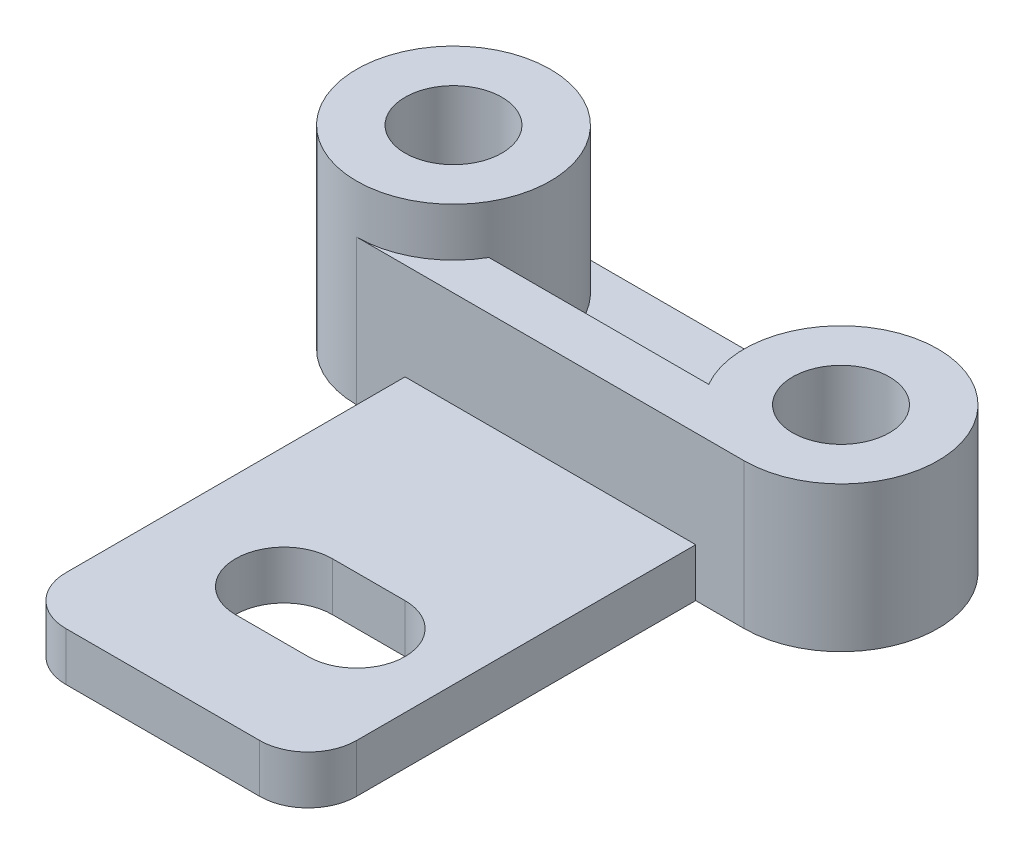
ISO-10303-21;
HEADER;
FILE_DESCRIPTION(('STEP AP214'),'2;1');
FILE_NAME('part.step','',(''),(''),'','','');
FILE_SCHEMA(('AUTOMOTIVE_DESIGN { 1 0 10303 214 1 1 1 1 }'));
ENDSEC;
DATA;
#1=APPLICATION_CONTEXT('core data for automotive mechanical design processes');
#2=APPLICATION_PROTOCOL_DEFINITION('international standard','automotive_design',2000,#1);
#3=PRODUCT_CONTEXT('',#1,'mechanical');
#4=PRODUCT('Part','Part','',(#3));
#5=PRODUCT_RELATED_PRODUCT_CATEGORY('part','',(#4));
#6=PRODUCT_DEFINITION_FORMATION('','',#4);
#7=PRODUCT_DEFINITION_CONTEXT('part definition',#1,'design');
#8=PRODUCT_DEFINITION('design','',#6,#7);
#9=PRODUCT_DEFINITION_SHAPE('','',#8);
#10=(LENGTH_UNIT() NAMED_UNIT(*) SI_UNIT(.MILLI.,.METRE.));
#11=(NAMED_UNIT(*) PLANE_ANGLE_UNIT() SI_UNIT($,.RADIAN.));
#12=(NAMED_UNIT(*) SI_UNIT($,.STERADIAN.) SOLID_ANGLE_UNIT());
#13=UNCERTAINTY_MEASURE_WITH_UNIT(LENGTH_MEASURE(1.E-05),#10,'distance_accuracy_value','');
#14=(GEOMETRIC_REPRESENTATION_CONTEXT(3) GLOBAL_UNCERTAINTY_ASSIGNED_CONTEXT((#13)) GLOBAL_UNIT_ASSIGNED_CONTEXT((#10,
#11,#12)) REPRESENTATION_CONTEXT('',''));
#15=CARTESIAN_POINT('',(0.,0.,0.));
#16=DIRECTION('',(0.,0.,1.));
#17=DIRECTION('',(1.,0.,0.));
#18=AXIS2_PLACEMENT_3D('',#15,#16,#17);
#19=CARTESIAN_POINT('',(0.,0.,20.));
#20=DIRECTION('',(0.,0.,1.));
#21=DIRECTION('',(1.,0.,0.));
#22=AXIS2_PLACEMENT_3D('',#19,#20,#21);
#23=PLANE('',#22);
#24=DIRECTION('',(1.,0.,0.));
#25=VECTOR('',#24,1.);
#26=CARTESIAN_POINT('',(0.,0.,20.));
#27=LINE('',#26,#25);
#28=CARTESIAN_POINT('',(0.,0.,20.));
#29=VERTEX_POINT('',#28);
#30=CARTESIAN_POINT('',(10.,0.,20.));
#31=VERTEX_POINT('',#30);
#32=EDGE_CURVE('E312',#29,#31,#27,.T.);
#33=ORIENTED_EDGE('',*,*,#32,.T.);
#34=DIRECTION('',(0.,-1.,0.));
#35=VECTOR('',#34,1.);
#36=CARTESIAN_POINT('',(10.,10.,20.));
#37=LINE('',#36,#35);
#38=CARTESIAN_POINT('',(10.,10.,20.));
#39=VERTEX_POINT('',#38);
#40=EDGE_CURVE('E237',#39,#31,#37,.T.);
#41=ORIENTED_EDGE('',*,*,#40,.F.);
#42=DIRECTION('',(-1.,0.,0.));
#43=VECTOR('',#42,1.);
#44=CARTESIAN_POINT('',(10.,10.,20.));
#45=LINE('',#44,#43);
#46=CARTESIAN_POINT('',(70.,10.,20.));
#47=VERTEX_POINT('',#46);
#48=EDGE_CURVE('E234',#47,#39,#45,.T.);
#49=ORIENTED_EDGE('',*,*,#48,.F.);
#50=DIRECTION('',(0.,-1.,0.));
#51=VECTOR('',#50,1.);
#52=CARTESIAN_POINT('',(70.,10.,20.));
#53=LINE('',#52,#51);
#54=CARTESIAN_POINT('',(70.,0.,20.));
#55=VERTEX_POINT('',#54);
#56=EDGE_CURVE('E254',#47,#55,#53,.T.);
#57=ORIENTED_EDGE('',*,*,#56,.T.);
#58=CARTESIAN_POINT('',(80.,0.,20.));
#59=VERTEX_POINT('',#58);
#60=EDGE_CURVE('E317',#55,#59,#27,.T.);
#61=ORIENTED_EDGE('',*,*,#60,.T.);
#62=DIRECTION('',(0.,1.,0.));
#63=VECTOR('',#62,1.);
#64=CARTESIAN_POINT('',(80.,0.,20.));
#65=LINE('',#64,#63);
#66=CARTESIAN_POINT('',(80.,30.,20.));
#67=VERTEX_POINT('',#66);
#68=EDGE_CURVE('E324',#59,#67,#65,.T.);
#69=ORIENTED_EDGE('',*,*,#68,.T.);
#70=DIRECTION('',(1.,0.,0.));
#71=VECTOR('',#70,1.);
#72=CARTESIAN_POINT('',(0.,30.,20.));
#73=LINE('',#72,#71);
#74=CARTESIAN_POINT('',(0.,30.,20.));
#75=VERTEX_POINT('',#74);
#76=EDGE_CURVE('E320',#75,#67,#73,.T.);
#77=ORIENTED_EDGE('',*,*,#76,.F.);
#78=DIRECTION('',(0.,1.,0.));
#79=VECTOR('',#78,1.);
#80=CARTESIAN_POINT('',(0.,0.,20.));
#81=LINE('',#80,#79);
#82=EDGE_CURVE('E316',#29,#75,#81,.T.);
#83=ORIENTED_EDGE('',*,*,#82,.F.);
#84=EDGE_LOOP('',(#33,#41,#49,#57,#61,#69,#77,#83));
#85=FACE_BOUND('',#84,.T.);
#86=ADVANCED_FACE('F45',(#85),#23,.T.);
#87=CARTESIAN_POINT('',(0.,0.,10.));
#88=DIRECTION('',(0.,0.,-1.));
#89=DIRECTION('',(-1.,0.,0.));
#90=AXIS2_PLACEMENT_3D('',#87,#88,#89);
#91=PLANE('',#90);
#92=DIRECTION('',(0.,-1.,0.));
#93=VECTOR('',#92,1.);
#94=CARTESIAN_POINT('',(62.6794919243112,30.,10.));
#95=LINE('',#94,#93);
#96=CARTESIAN_POINT('',(62.6794919243112,30.,10.));
#97=VERTEX_POINT('',#96);
#98=CARTESIAN_POINT('',(62.6794919243112,9.99999999999999,10.));
#99=VERTEX_POINT('',#98);
#100=EDGE_CURVE('E305',#97,#99,#95,.T.);
#101=ORIENTED_EDGE('',*,*,#100,.T.);
#102=DIRECTION('',(-1.,0.,0.));
#103=VECTOR('',#102,1.);
#104=CARTESIAN_POINT('',(0.,10.,10.));
#105=LINE('',#104,#103);
#106=CARTESIAN_POINT('',(17.3205080756888,9.99999999999999,10.));
#107=VERTEX_POINT('',#106);
#108=EDGE_CURVE('E291',#99,#107,#105,.T.);
#109=ORIENTED_EDGE('',*,*,#108,.T.);
#110=DIRECTION('',(0.,-1.,0.));
#111=VECTOR('',#110,1.);
#112=CARTESIAN_POINT('',(17.3205080756888,40.,10.));
#113=LINE('',#112,#111);
#114=CARTESIAN_POINT('',(17.3205080756888,30.,10.));
#115=VERTEX_POINT('',#114);
#116=EDGE_CURVE('E333',#115,#107,#113,.T.);
#117=ORIENTED_EDGE('',*,*,#116,.F.);
#118=DIRECTION('',(-1.,0.,0.));
#119=VECTOR('',#118,1.);
#120=CARTESIAN_POINT('',(0.,30.,10.));
#121=LINE('',#120,#119);
#122=EDGE_CURVE('E311',#97,#115,#121,.T.);
#123=ORIENTED_EDGE('',*,*,#122,.F.);
#124=EDGE_LOOP('',(#101,#109,#117,#123));
#125=FACE_BOUND('',#124,.T.);
#126=ADVANCED_FACE('F383',(#125),#91,.T.);
#127=CARTESIAN_POINT('',(0.,0.,0.));
#128=DIRECTION('',(0.,1.,0.));
#129=DIRECTION('',(0.,0.,1.));
#130=AXIS2_PLACEMENT_3D('',#127,#128,#129);
#131=CYLINDRICAL_SURFACE('',#130,10.);
#132=CARTESIAN_POINT('',(0.,40.,0.));
#133=DIRECTION('',(0.,1.,0.));
#134=DIRECTION('',(0.,0.,1.));
#135=AXIS2_PLACEMENT_3D('',#132,#133,#134);
#136=CIRCLE('',#135,10.);
#137=CARTESIAN_POINT('',(0.,40.,10.));
#138=VERTEX_POINT('',#137);
#139=EDGE_CURVE('E336',#138,#138,#136,.T.);
#140=ORIENTED_EDGE('',*,*,#139,.T.);
#141=EDGE_LOOP('',(#140));
#142=FACE_BOUND('',#141,.T.);
#143=CARTESIAN_POINT('',(0.,10.,0.));
#144=DIRECTION('',(0.,-1.,0.));
#145=DIRECTION('',(0.,0.,-1.));
#146=AXIS2_PLACEMENT_3D('',#143,#144,#145);
#147=CIRCLE('',#146,10.);
#148=CARTESIAN_POINT('',(0.,10.,-10.));
#149=VERTEX_POINT('',#148);
#150=EDGE_CURVE('E11',#149,#149,#147,.F.);
#151=ORIENTED_EDGE('',*,*,#150,.F.);
#152=EDGE_LOOP('',(#151));
#153=FACE_BOUND('',#152,.T.);
#154=ADVANCED_FACE('F390',(#142,#153),#131,.F.);
#155=CARTESIAN_POINT('',(80.,30.,0.));
#156=DIRECTION('',(0.,-1.,0.));
#157=DIRECTION('',(0.,0.,-1.));
#158=AXIS2_PLACEMENT_3D('',#155,#156,#157);
#159=CYLINDRICAL_SURFACE('',#158,20.);
#160=CARTESIAN_POINT('',(80.,30.,0.));
#161=DIRECTION('',(0.,1.,0.));
#162=DIRECTION('',(0.,0.,1.));
#163=AXIS2_PLACEMENT_3D('',#160,#161,#162);
#164=CIRCLE('',#163,20.);
#165=EDGE_CURVE('E301',#67,#97,#164,.T.);
#166=ORIENTED_EDGE('',*,*,#165,.F.);
#167=ORIENTED_EDGE('',*,*,#68,.F.);
#168=CARTESIAN_POINT('',(80.,0.,0.));
#169=DIRECTION('',(0.,1.,0.));
#170=DIRECTION('',(0.,0.,1.));
#171=AXIS2_PLACEMENT_3D('',#168,#169,#170);
#172=CIRCLE('',#171,20.);
#173=CARTESIAN_POINT('',(80.,0.,-20.));
#174=VERTEX_POINT('',#173);
#175=EDGE_CURVE('E300',#59,#174,#172,.T.);
#176=ORIENTED_EDGE('',*,*,#175,.T.);
#177=DIRECTION('',(0.,-1.,0.));
#178=VECTOR('',#177,1.);
#179=CARTESIAN_POINT('',(80.,10.,-20.));
#180=LINE('',#179,#178);
#181=CARTESIAN_POINT('',(80.,9.99999999999999,-20.));
#182=VERTEX_POINT('',#181);
#183=EDGE_CURVE('E281',#182,#174,#180,.T.);
#184=ORIENTED_EDGE('',*,*,#183,.F.);
#185=CARTESIAN_POINT('',(80.,9.99999999999999,0.));
#186=DIRECTION('',(0.,-1.,0.));
#187=DIRECTION('',(0.,0.,-1.));
#188=AXIS2_PLACEMENT_3D('',#185,#186,#187);
#189=CIRCLE('',#188,20.);
#190=EDGE_CURVE('E285',#99,#182,#189,.T.);
#191=ORIENTED_EDGE('',*,*,#190,.F.);
#192=ORIENTED_EDGE('',*,*,#100,.F.);
#193=EDGE_LOOP('',(#166,#167,#176,#184,#191,#192));
#194=FACE_BOUND('',#193,.T.);
#195=ADVANCED_FACE('F399',(#194),#159,.T.);
#196=CARTESIAN_POINT('',(80.,0.,0.));
#197=DIRECTION('',(0.,1.,0.));
#198=DIRECTION('',(0.,0.,1.));
#199=AXIS2_PLACEMENT_3D('',#196,#197,#198);
#200=CYLINDRICAL_SURFACE('',#199,9.99999999999999);
#201=CARTESIAN_POINT('',(80.,30.,0.));
#202=DIRECTION('',(0.,1.,0.));
#203=DIRECTION('',(0.,0.,1.));
#204=AXIS2_PLACEMENT_3D('',#201,#202,#203);
#205=CIRCLE('',#204,9.99999999999999);
#206=CARTESIAN_POINT('',(80.,30.,9.99999999999999));
#207=VERTEX_POINT('',#206);
#208=EDGE_CURVE('E295',#207,#207,#205,.T.);
#209=ORIENTED_EDGE('',*,*,#208,.T.);
#210=EDGE_LOOP('',(#209));
#211=FACE_BOUND('',#210,.T.);
#212=CARTESIAN_POINT('',(80.,10.,0.));
#213=DIRECTION('',(0.,-1.,0.));
#214=DIRECTION('',(0.,0.,-1.));
#215=AXIS2_PLACEMENT_3D('',#212,#213,#214);
#216=CIRCLE('',#215,9.99999999999999);
#217=CARTESIAN_POINT('',(80.,10.,-9.99999999999999));
#218=VERTEX_POINT('',#217);
#219=EDGE_CURVE('E49',#218,#218,#216,.F.);
#220=ORIENTED_EDGE('',*,*,#219,.F.);
#221=EDGE_LOOP('',(#220));
#222=FACE_BOUND('',#221,.T.);
#223=ADVANCED_FACE('F422',(#211,#222),#200,.F.);
#224=CARTESIAN_POINT('',(0.,40.,0.));
#225=DIRECTION('',(0.,-1.,0.));
#226=DIRECTION('',(0.,0.,-1.));
#227=AXIS2_PLACEMENT_3D('',#224,#225,#226);
#228=CYLINDRICAL_SURFACE('',#227,20.);
#229=ORIENTED_EDGE('',*,*,#82,.T.);
#230=CARTESIAN_POINT('',(0.,30.,0.));
#231=DIRECTION('',(0.,1.,0.));
#232=DIRECTION('',(0.,0.,1.));
#233=AXIS2_PLACEMENT_3D('',#230,#231,#232);
#234=CIRCLE('',#233,20.);
#235=EDGE_CURVE('E327',#75,#115,#234,.T.);
#236=ORIENTED_EDGE('',*,*,#235,.T.);
#237=ORIENTED_EDGE('',*,*,#116,.T.);
#238=CARTESIAN_POINT('',(0.,9.99999999999999,0.));
#239=DIRECTION('',(0.,-1.,0.));
#240=DIRECTION('',(0.,0.,-1.));
#241=AXIS2_PLACEMENT_3D('',#238,#239,#240);
#242=CIRCLE('',#241,20.);
#243=CARTESIAN_POINT('',(0.,9.99999999999999,-20.));
#244=VERTEX_POINT('',#243);
#245=EDGE_CURVE('E70',#244,#107,#242,.T.);
#246=ORIENTED_EDGE('',*,*,#245,.F.);
#247=DIRECTION('',(0.,-1.,0.));
#248=VECTOR('',#247,1.);
#249=CARTESIAN_POINT('',(0.,10.,-20.));
#250=LINE('',#249,#248);
#251=CARTESIAN_POINT('',(0.,0.,-20.));
#252=VERTEX_POINT('',#251);
#253=EDGE_CURVE('E277',#244,#252,#250,.T.);
#254=ORIENTED_EDGE('',*,*,#253,.T.);
#255=CARTESIAN_POINT('',(0.,0.,0.));
#256=DIRECTION('',(0.,1.,0.));
#257=DIRECTION('',(0.,0.,1.));
#258=AXIS2_PLACEMENT_3D('',#255,#256,#257);
#259=CIRCLE('',#258,20.);
#260=EDGE_CURVE('E340',#252,#29,#259,.T.);
#261=ORIENTED_EDGE('',*,*,#260,.T.);
#262=EDGE_LOOP('',(#229,#236,#237,#246,#254,#261));
#263=FACE_BOUND('',#262,.T.);
#264=CARTESIAN_POINT('',(0.,40.,0.));
#265=DIRECTION('',(0.,1.,0.));
#266=DIRECTION('',(0.,0.,1.));
#267=AXIS2_PLACEMENT_3D('',#264,#265,#266);
#268=CIRCLE('',#267,20.);
#269=CARTESIAN_POINT('',(0.,40.,20.));
#270=VERTEX_POINT('',#269);
#271=EDGE_CURVE('E341',#270,#270,#268,.T.);
#272=ORIENTED_EDGE('',*,*,#271,.F.);
#273=EDGE_LOOP('',(#272));
#274=FACE_BOUND('',#273,.T.);
#275=ADVANCED_FACE('F47',(#263,#274),#228,.T.);
#276=CARTESIAN_POINT('',(0.,40.,0.));
#277=DIRECTION('',(0.,1.,0.));
#278=DIRECTION('',(0.,0.,1.));
#279=AXIS2_PLACEMENT_3D('',#276,#277,#278);
#280=PLANE('',#279);
#281=ORIENTED_EDGE('',*,*,#139,.F.);
#282=EDGE_LOOP('',(#281));
#283=FACE_BOUND('',#282,.T.);
#284=ORIENTED_EDGE('',*,*,#271,.T.);
#285=EDGE_LOOP('',(#284));
#286=FACE_BOUND('',#285,.T.);
#287=ADVANCED_FACE('F401',(#283,#286),#280,.T.);
#288=CARTESIAN_POINT('',(0.,0.,0.));
#289=DIRECTION('',(0.,1.,0.));
#290=DIRECTION('',(0.,0.,1.));
#291=AXIS2_PLACEMENT_3D('',#288,#289,#290);
#292=PLANE('',#291);
#293=ORIENTED_EDGE('',*,*,#260,.F.);
#294=DIRECTION('',(1.,0.,0.));
#295=VECTOR('',#294,1.);
#296=CARTESIAN_POINT('',(0.,0.,-20.));
#297=LINE('',#296,#295);
#298=EDGE_CURVE('E272',#252,#174,#297,.T.);
#299=ORIENTED_EDGE('',*,*,#298,.T.);
#300=ORIENTED_EDGE('',*,*,#175,.F.);
#301=ORIENTED_EDGE('',*,*,#60,.F.);
#302=DIRECTION('',(0.,0.,-1.));
#303=VECTOR('',#302,1.);
#304=CARTESIAN_POINT('',(70.,0.,20.));
#305=LINE('',#304,#303);
#306=CARTESIAN_POINT('',(70.,0.,90.));
#307=VERTEX_POINT('',#306);
#308=EDGE_CURVE('E62',#307,#55,#305,.T.);
#309=ORIENTED_EDGE('',*,*,#308,.F.);
#310=CARTESIAN_POINT('',(60.,0.,90.));
#311=DIRECTION('',(0.,1.,0.));
#312=DIRECTION('',(0.,0.,1.));
#313=AXIS2_PLACEMENT_3D('',#310,#311,#312);
#314=CIRCLE('',#313,9.99999999999999);
#315=CARTESIAN_POINT('',(60.,0.,100.));
#316=VERTEX_POINT('',#315);
#317=EDGE_CURVE('E247',#316,#307,#314,.T.);
#318=ORIENTED_EDGE('',*,*,#317,.F.);
#319=DIRECTION('',(1.,0.,0.));
#320=VECTOR('',#319,1.);
#321=CARTESIAN_POINT('',(20.,0.,100.));
#322=LINE('',#321,#320);
#323=CARTESIAN_POINT('',(20.,0.,100.));
#324=VERTEX_POINT('',#323);
#325=EDGE_CURVE('E244',#324,#316,#322,.T.);
#326=ORIENTED_EDGE('',*,*,#325,.F.);
#327=CARTESIAN_POINT('',(20.,0.,90.));
#328=DIRECTION('',(0.,1.,0.));
#329=DIRECTION('',(0.,0.,1.));
#330=AXIS2_PLACEMENT_3D('',#327,#328,#329);
#331=CIRCLE('',#330,10.);
#332=CARTESIAN_POINT('',(10.,0.,90.));
#333=VERTEX_POINT('',#332);
#334=EDGE_CURVE('E241',#333,#324,#331,.T.);
#335=ORIENTED_EDGE('',*,*,#334,.F.);
#336=DIRECTION('',(0.,0.,1.));
#337=VECTOR('',#336,1.);
#338=CARTESIAN_POINT('',(10.,0.,20.));
#339=LINE('',#338,#337);
#340=EDGE_CURVE('E184',#31,#333,#339,.T.);
#341=ORIENTED_EDGE('',*,*,#340,.F.);
#342=ORIENTED_EDGE('',*,*,#32,.F.);
#343=EDGE_LOOP('',(#293,#299,#300,#301,#309,#318,#326,#335,#341,#342));
#344=FACE_BOUND('',#343,.T.);
#345=CARTESIAN_POINT('',(35.,0.,70.));
#346=DIRECTION('',(0.,1.,0.));
#347=DIRECTION('',(0.,0.,1.));
#348=AXIS2_PLACEMENT_3D('',#345,#346,#347);
#349=CIRCLE('',#348,10.);
#350=CARTESIAN_POINT('',(35.,0.,60.));
#351=VERTEX_POINT('',#350);
#352=CARTESIAN_POINT('',(35.,0.,80.));
#353=VERTEX_POINT('',#352);
#354=EDGE_CURVE('E199',#351,#353,#349,.T.);
#355=ORIENTED_EDGE('',*,*,#354,.T.);
#356=DIRECTION('',(1.,0.,0.));
#357=VECTOR('',#356,1.);
#358=CARTESIAN_POINT('',(35.,0.,80.));
#359=LINE('',#358,#357);
#360=CARTESIAN_POINT('',(50.,0.,80.));
#361=VERTEX_POINT('',#360);
#362=EDGE_CURVE('E182',#353,#361,#359,.T.);
#363=ORIENTED_EDGE('',*,*,#362,.T.);
#364=CARTESIAN_POINT('',(50.,0.,70.));
#365=DIRECTION('',(0.,1.,0.));
#366=DIRECTION('',(0.,0.,1.));
#367=AXIS2_PLACEMENT_3D('',#364,#365,#366);
#368=CIRCLE('',#367,10.);
#369=CARTESIAN_POINT('',(50.,0.,60.));
#370=VERTEX_POINT('',#369);
#371=EDGE_CURVE('E204',#361,#370,#368,.T.);
#372=ORIENTED_EDGE('',*,*,#371,.T.);
#373=DIRECTION('',(-1.,0.,0.));
#374=VECTOR('',#373,1.);
#375=CARTESIAN_POINT('',(35.,0.,60.));
#376=LINE('',#375,#374);
#377=EDGE_CURVE('E176',#370,#351,#376,.T.);
#378=ORIENTED_EDGE('',*,*,#377,.T.);
#379=EDGE_LOOP('',(#355,#363,#372,#378));
#380=FACE_BOUND('',#379,.T.);
#381=ADVANCED_FACE('F356',(#344,#380),#292,.F.);
#382=CARTESIAN_POINT('',(0.,30.,0.));
#383=DIRECTION('',(0.,1.,0.));
#384=DIRECTION('',(0.,0.,1.));
#385=AXIS2_PLACEMENT_3D('',#382,#383,#384);
#386=PLANE('',#385);
#387=ORIENTED_EDGE('',*,*,#165,.T.);
#388=ORIENTED_EDGE('',*,*,#122,.T.);
#389=ORIENTED_EDGE('',*,*,#235,.F.);
#390=ORIENTED_EDGE('',*,*,#76,.T.);
#391=EDGE_LOOP('',(#387,#388,#389,#390));
#392=FACE_BOUND('',#391,.T.);
#393=ORIENTED_EDGE('',*,*,#208,.F.);
#394=EDGE_LOOP('',(#393));
#395=FACE_BOUND('',#394,.T.);
#396=ADVANCED_FACE('F394',(#392,#395),#386,.T.);
#397=CARTESIAN_POINT('',(0.,10.,0.));
#398=DIRECTION('',(0.,-1.,0.));
#399=DIRECTION('',(0.,0.,-1.));
#400=AXIS2_PLACEMENT_3D('',#397,#398,#399);
#401=PLANE('',#400);
#402=ORIENTED_EDGE('',*,*,#219,.T.);
#403=EDGE_LOOP('',(#402));
#404=FACE_BOUND('',#403,.T.);
#405=ADVANCED_FACE('F408',(#404),#401,.F.);
#406=DIRECTION('',(1.,0.,0.));
#407=VECTOR('',#406,1.);
#408=CARTESIAN_POINT('',(0.,10.,-20.));
#409=LINE('',#408,#407);
#410=EDGE_CURVE('E273',#244,#182,#409,.T.);
#411=ORIENTED_EDGE('',*,*,#410,.F.);
#412=ORIENTED_EDGE('',*,*,#245,.T.);
#413=ORIENTED_EDGE('',*,*,#108,.F.);
#414=ORIENTED_EDGE('',*,*,#190,.T.);
#415=EDGE_LOOP('',(#411,#412,#413,#414));
#416=FACE_BOUND('',#415,.T.);
#417=ADVANCED_FACE('F413',(#416),#401,.F.);
#418=CARTESIAN_POINT('',(0.,10.,-20.));
#419=DIRECTION('',(0.,0.,-1.));
#420=DIRECTION('',(-1.,0.,0.));
#421=AXIS2_PLACEMENT_3D('',#418,#419,#420);
#422=PLANE('',#421);
#423=ORIENTED_EDGE('',*,*,#298,.F.);
#424=ORIENTED_EDGE('',*,*,#253,.F.);
#425=ORIENTED_EDGE('',*,*,#410,.T.);
#426=ORIENTED_EDGE('',*,*,#183,.T.);
#427=EDGE_LOOP('',(#423,#424,#425,#426));
#428=FACE_BOUND('',#427,.T.);
#429=ADVANCED_FACE('F435',(#428),#422,.T.);
#430=ORIENTED_EDGE('',*,*,#150,.T.);
#431=EDGE_LOOP('',(#430));
#432=FACE_BOUND('',#431,.T.);
#433=ADVANCED_FACE('F416',(#432),#401,.F.);
#434=CARTESIAN_POINT('',(20.,10.,90.));
#435=DIRECTION('',(0.,1.,0.));
#436=DIRECTION('',(0.,0.,1.));
#437=AXIS2_PLACEMENT_3D('',#434,#435,#436);
#438=PLANE('',#437);
#439=DIRECTION('',(0.,0.,1.));
#440=VECTOR('',#439,1.);
#441=CARTESIAN_POINT('',(10.,10.,20.));
#442=LINE('',#441,#440);
#443=CARTESIAN_POINT('',(10.,10.,90.));
#444=VERTEX_POINT('',#443);
#445=EDGE_CURVE('E218',#39,#444,#442,.T.);
#446=ORIENTED_EDGE('',*,*,#445,.T.);
#447=CARTESIAN_POINT('',(20.,10.,90.));
#448=DIRECTION('',(0.,1.,0.));
#449=DIRECTION('',(0.,0.,1.));
#450=AXIS2_PLACEMENT_3D('',#447,#448,#449);
#451=CIRCLE('',#450,10.);
#452=CARTESIAN_POINT('',(20.,10.,100.));
#453=VERTEX_POINT('',#452);
#454=EDGE_CURVE('E222',#444,#453,#451,.T.);
#455=ORIENTED_EDGE('',*,*,#454,.T.);
#456=DIRECTION('',(1.,0.,0.));
#457=VECTOR('',#456,1.);
#458=CARTESIAN_POINT('',(20.,10.,100.));
#459=LINE('',#458,#457);
#460=CARTESIAN_POINT('',(60.,10.,100.));
#461=VERTEX_POINT('',#460);
#462=EDGE_CURVE('E225',#453,#461,#459,.T.);
#463=ORIENTED_EDGE('',*,*,#462,.T.);
#464=CARTESIAN_POINT('',(60.,10.,90.));
#465=DIRECTION('',(0.,1.,0.));
#466=DIRECTION('',(0.,0.,1.));
#467=AXIS2_PLACEMENT_3D('',#464,#465,#466);
#468=CIRCLE('',#467,9.99999999999999);
#469=CARTESIAN_POINT('',(70.,10.,90.));
#470=VERTEX_POINT('',#469);
#471=EDGE_CURVE('E228',#461,#470,#468,.T.);
#472=ORIENTED_EDGE('',*,*,#471,.T.);
#473=DIRECTION('',(0.,0.,-1.));
#474=VECTOR('',#473,1.);
#475=CARTESIAN_POINT('',(70.,10.,20.));
#476=LINE('',#475,#474);
#477=EDGE_CURVE('E231',#470,#47,#476,.T.);
#478=ORIENTED_EDGE('',*,*,#477,.T.);
#479=ORIENTED_EDGE('',*,*,#48,.T.);
#480=EDGE_LOOP('',(#446,#455,#463,#472,#478,#479));
#481=FACE_BOUND('',#480,.T.);
#482=DIRECTION('',(1.,0.,0.));
#483=VECTOR('',#482,1.);
#484=CARTESIAN_POINT('',(35.,10.,80.));
#485=LINE('',#484,#483);
#486=CARTESIAN_POINT('',(35.,10.,80.));
#487=VERTEX_POINT('',#486);
#488=CARTESIAN_POINT('',(50.,10.,80.));
#489=VERTEX_POINT('',#488);
#490=EDGE_CURVE('E175',#487,#489,#485,.T.);
#491=ORIENTED_EDGE('',*,*,#490,.F.);
#492=CARTESIAN_POINT('',(35.,10.,70.));
#493=DIRECTION('',(0.,1.,0.));
#494=DIRECTION('',(0.,0.,1.));
#495=AXIS2_PLACEMENT_3D('',#492,#493,#494);
#496=CIRCLE('',#495,10.);
#497=CARTESIAN_POINT('',(35.,10.,60.));
#498=VERTEX_POINT('',#497);
#499=EDGE_CURVE('E164',#498,#487,#496,.T.);
#500=ORIENTED_EDGE('',*,*,#499,.F.);
#501=DIRECTION('',(-1.,0.,0.));
#502=VECTOR('',#501,1.);
#503=CARTESIAN_POINT('',(35.,10.,60.));
#504=LINE('',#503,#502);
#505=CARTESIAN_POINT('',(50.,10.,60.));
#506=VERTEX_POINT('',#505);
#507=EDGE_CURVE('E194',#506,#498,#504,.T.);
#508=ORIENTED_EDGE('',*,*,#507,.F.);
#509=CARTESIAN_POINT('',(50.,10.,70.));
#510=DIRECTION('',(0.,1.,0.));
#511=DIRECTION('',(0.,0.,1.));
#512=AXIS2_PLACEMENT_3D('',#509,#510,#511);
#513=CIRCLE('',#512,10.);
#514=EDGE_CURVE('E190',#489,#506,#513,.T.);
#515=ORIENTED_EDGE('',*,*,#514,.F.);
#516=EDGE_LOOP('',(#491,#500,#508,#515));
#517=FACE_BOUND('',#516,.T.);
#518=ADVANCED_FACE('F188',(#481,#517),#438,.T.);
#519=CARTESIAN_POINT('',(10.,10.,20.));
#520=DIRECTION('',(1.,0.,0.));
#521=DIRECTION('',(0.,0.,-1.));
#522=AXIS2_PLACEMENT_3D('',#519,#520,#521);
#523=PLANE('',#522);
#524=ORIENTED_EDGE('',*,*,#340,.T.);
#525=DIRECTION('',(0.,-1.,0.));
#526=VECTOR('',#525,1.);
#527=CARTESIAN_POINT('',(10.,10.,90.));
#528=LINE('',#527,#526);
#529=EDGE_CURVE('E268',#444,#333,#528,.T.);
#530=ORIENTED_EDGE('',*,*,#529,.F.);
#531=ORIENTED_EDGE('',*,*,#445,.F.);
#532=ORIENTED_EDGE('',*,*,#40,.T.);
#533=EDGE_LOOP('',(#524,#530,#531,#532));
#534=FACE_BOUND('',#533,.T.);
#535=ADVANCED_FACE('F361',(#534),#523,.F.);
#536=CARTESIAN_POINT('',(20.,10.,90.));
#537=DIRECTION('',(0.,-1.,0.));
#538=DIRECTION('',(0.,0.,-1.));
#539=AXIS2_PLACEMENT_3D('',#536,#537,#538);
#540=CYLINDRICAL_SURFACE('',#539,10.);
#541=ORIENTED_EDGE('',*,*,#334,.T.);
#542=DIRECTION('',(0.,-1.,0.));
#543=VECTOR('',#542,1.);
#544=CARTESIAN_POINT('',(20.,10.,100.));
#545=LINE('',#544,#543);
#546=EDGE_CURVE('E264',#453,#324,#545,.T.);
#547=ORIENTED_EDGE('',*,*,#546,.F.);
#548=ORIENTED_EDGE('',*,*,#454,.F.);
#549=ORIENTED_EDGE('',*,*,#529,.T.);
#550=EDGE_LOOP('',(#541,#547,#548,#549));
#551=FACE_BOUND('',#550,.T.);
#552=ADVANCED_FACE('F442',(#551),#540,.T.);
#553=CARTESIAN_POINT('',(20.,10.,100.));
#554=DIRECTION('',(0.,0.,-1.));
#555=DIRECTION('',(-1.,0.,0.));
#556=AXIS2_PLACEMENT_3D('',#553,#554,#555);
#557=PLANE('',#556);
#558=ORIENTED_EDGE('',*,*,#325,.T.);
#559=DIRECTION('',(0.,-1.,0.));
#560=VECTOR('',#559,1.);
#561=CARTESIAN_POINT('',(60.,10.,100.));
#562=LINE('',#561,#560);
#563=EDGE_CURVE('E260',#461,#316,#562,.T.);
#564=ORIENTED_EDGE('',*,*,#563,.F.);
#565=ORIENTED_EDGE('',*,*,#462,.F.);
#566=ORIENTED_EDGE('',*,*,#546,.T.);
#567=EDGE_LOOP('',(#558,#564,#565,#566));
#568=FACE_BOUND('',#567,.T.);
#569=ADVANCED_FACE('F378',(#568),#557,.F.);
#570=CARTESIAN_POINT('',(60.,10.,90.));
#571=DIRECTION('',(0.,-1.,0.));
#572=DIRECTION('',(0.,0.,-1.));
#573=AXIS2_PLACEMENT_3D('',#570,#571,#572);
#574=CYLINDRICAL_SURFACE('',#573,9.99999999999999);
#575=ORIENTED_EDGE('',*,*,#317,.T.);
#576=DIRECTION('',(0.,-1.,0.));
#577=VECTOR('',#576,1.);
#578=CARTESIAN_POINT('',(70.,10.,90.));
#579=LINE('',#578,#577);
#580=EDGE_CURVE('E257',#470,#307,#579,.T.);
#581=ORIENTED_EDGE('',*,*,#580,.F.);
#582=ORIENTED_EDGE('',*,*,#471,.F.);
#583=ORIENTED_EDGE('',*,*,#563,.T.);
#584=EDGE_LOOP('',(#575,#581,#582,#583));
#585=FACE_BOUND('',#584,.T.);
#586=ADVANCED_FACE('F371',(#585),#574,.T.);
#587=CARTESIAN_POINT('',(70.,10.,20.));
#588=DIRECTION('',(-1.,0.,0.));
#589=DIRECTION('',(0.,0.,1.));
#590=AXIS2_PLACEMENT_3D('',#587,#588,#589);
#591=PLANE('',#590);
#592=ORIENTED_EDGE('',*,*,#308,.T.);
#593=ORIENTED_EDGE('',*,*,#56,.F.);
#594=ORIENTED_EDGE('',*,*,#477,.F.);
#595=ORIENTED_EDGE('',*,*,#580,.T.);
#596=EDGE_LOOP('',(#592,#593,#594,#595));
#597=FACE_BOUND('',#596,.T.);
#598=ADVANCED_FACE('F369',(#597),#591,.F.);
#599=CARTESIAN_POINT('',(35.,10.,70.));
#600=DIRECTION('',(0.,-1.,0.));
#601=DIRECTION('',(0.,0.,-1.));
#602=AXIS2_PLACEMENT_3D('',#599,#600,#601);
#603=CYLINDRICAL_SURFACE('',#602,10.);
#604=ORIENTED_EDGE('',*,*,#354,.F.);
#605=DIRECTION('',(0.,-1.,0.));
#606=VECTOR('',#605,1.);
#607=CARTESIAN_POINT('',(35.,10.,60.));
#608=LINE('',#607,#606);
#609=EDGE_CURVE('E170',#498,#351,#608,.T.);
#610=ORIENTED_EDGE('',*,*,#609,.F.);
#611=ORIENTED_EDGE('',*,*,#499,.T.);
#612=DIRECTION('',(0.,-1.,0.));
#613=VECTOR('',#612,1.);
#614=CARTESIAN_POINT('',(35.,10.,80.));
#615=LINE('',#614,#613);
#616=EDGE_CURVE('E167',#487,#353,#615,.T.);
#617=ORIENTED_EDGE('',*,*,#616,.T.);
#618=EDGE_LOOP('',(#604,#610,#611,#617));
#619=FACE_BOUND('',#618,.T.);
#620=ADVANCED_FACE('F166',(#619),#603,.F.);
#621=CARTESIAN_POINT('',(35.,10.,80.));
#622=DIRECTION('',(0.,0.,-1.));
#623=DIRECTION('',(-1.,0.,0.));
#624=AXIS2_PLACEMENT_3D('',#621,#622,#623);
#625=PLANE('',#624);
#626=ORIENTED_EDGE('',*,*,#362,.F.);
#627=ORIENTED_EDGE('',*,*,#616,.F.);
#628=ORIENTED_EDGE('',*,*,#490,.T.);
#629=DIRECTION('',(0.,-1.,0.));
#630=VECTOR('',#629,1.);
#631=CARTESIAN_POINT('',(50.,10.,80.));
#632=LINE('',#631,#630);
#633=EDGE_CURVE('E185',#489,#361,#632,.T.);
#634=ORIENTED_EDGE('',*,*,#633,.T.);
#635=EDGE_LOOP('',(#626,#627,#628,#634));
#636=FACE_BOUND('',#635,.T.);
#637=ADVANCED_FACE('F179',(#636),#625,.T.);
#638=CARTESIAN_POINT('',(50.,10.,70.));
#639=DIRECTION('',(0.,-1.,0.));
#640=DIRECTION('',(0.,0.,-1.));
#641=AXIS2_PLACEMENT_3D('',#638,#639,#640);
#642=CYLINDRICAL_SURFACE('',#641,10.);
#643=ORIENTED_EDGE('',*,*,#371,.F.);
#644=ORIENTED_EDGE('',*,*,#633,.F.);
#645=ORIENTED_EDGE('',*,*,#514,.T.);
#646=DIRECTION('',(0.,-1.,0.));
#647=VECTOR('',#646,1.);
#648=CARTESIAN_POINT('',(50.,10.,60.));
#649=LINE('',#648,#647);
#650=EDGE_CURVE('E213',#506,#370,#649,.T.);
#651=ORIENTED_EDGE('',*,*,#650,.T.);
#652=EDGE_LOOP('',(#643,#644,#645,#651));
#653=FACE_BOUND('',#652,.T.);
#654=ADVANCED_FACE('F535',(#653),#642,.F.);
#655=CARTESIAN_POINT('',(35.,10.,60.));
#656=DIRECTION('',(0.,0.,1.));
#657=DIRECTION('',(1.,0.,0.));
#658=AXIS2_PLACEMENT_3D('',#655,#656,#657);
#659=PLANE('',#658);
#660=ORIENTED_EDGE('',*,*,#377,.F.);
#661=ORIENTED_EDGE('',*,*,#650,.F.);
#662=ORIENTED_EDGE('',*,*,#507,.T.);
#663=ORIENTED_EDGE('',*,*,#609,.T.);
#664=EDGE_LOOP('',(#660,#661,#662,#663));
#665=FACE_BOUND('',#664,.T.);
#666=ADVANCED_FACE('F544',(#665),#659,.T.);
#667=CLOSED_SHELL('',(#86,#126,#154,#195,#223,#275,#287,#381,#396,#405,#417,#429,#433,#518,#535,
#552,#569,#586,#598,#620,#637,#654,#666));
#668=MANIFOLD_SOLID_BREP('B2',#667);
#669=ADVANCED_BREP_SHAPE_REPRESENTATION('',(#18,#668),#14);
#670=SHAPE_DEFINITION_REPRESENTATION(#9,#669);
ENDSEC;
END-ISO-10303-21;
